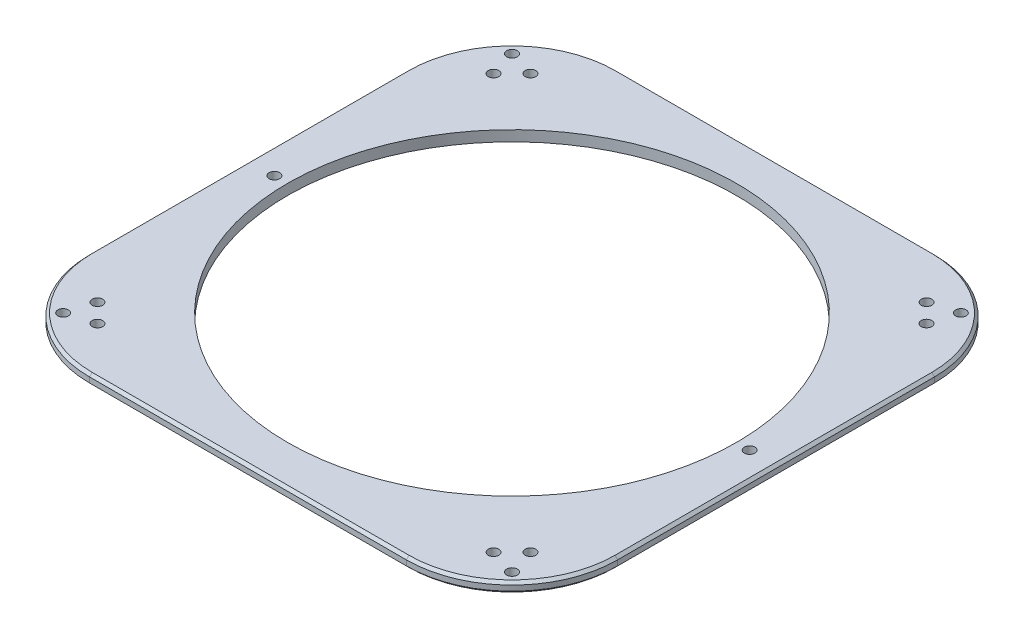
ISO-10303-21;
HEADER;
FILE_DESCRIPTION(('STEP AP214'),'2;1');
FILE_NAME('part.step','',(''),(''),'','','');
FILE_SCHEMA(('AUTOMOTIVE_DESIGN { 1 0 10303 214 1 1 1 1 }'));
ENDSEC;
DATA;
#1=APPLICATION_CONTEXT('core data for automotive mechanical design processes');
#2=APPLICATION_PROTOCOL_DEFINITION('international standard','automotive_design',2000,#1);
#3=PRODUCT_CONTEXT('',#1,'mechanical');
#4=PRODUCT('Part','Part','',(#3));
#5=PRODUCT_RELATED_PRODUCT_CATEGORY('part','',(#4));
#6=PRODUCT_DEFINITION_FORMATION('','',#4);
#7=PRODUCT_DEFINITION_CONTEXT('part definition',#1,'design');
#8=PRODUCT_DEFINITION('design','',#6,#7);
#9=PRODUCT_DEFINITION_SHAPE('','',#8);
#10=(LENGTH_UNIT() NAMED_UNIT(*) SI_UNIT(.MILLI.,.METRE.));
#11=(NAMED_UNIT(*) PLANE_ANGLE_UNIT() SI_UNIT($,.RADIAN.));
#12=(NAMED_UNIT(*) SI_UNIT($,.STERADIAN.) SOLID_ANGLE_UNIT());
#13=UNCERTAINTY_MEASURE_WITH_UNIT(LENGTH_MEASURE(1.E-05),#10,'distance_accuracy_value','');
#14=(GEOMETRIC_REPRESENTATION_CONTEXT(3) GLOBAL_UNCERTAINTY_ASSIGNED_CONTEXT((#13)) GLOBAL_UNIT_ASSIGNED_CONTEXT((#10,
#11,#12)) REPRESENTATION_CONTEXT('',''));
#15=CARTESIAN_POINT('',(0.,0.,0.));
#16=DIRECTION('',(0.,0.,1.));
#17=DIRECTION('',(1.,0.,0.));
#18=AXIS2_PLACEMENT_3D('',#15,#16,#17);
#19=CARTESIAN_POINT('',(0.,4.,0.));
#20=DIRECTION('',(0.,-1.,0.));
#21=DIRECTION('',(0.,0.,-1.));
#22=AXIS2_PLACEMENT_3D('',#19,#20,#21);
#23=PLANE('',#22);
#24=CARTESIAN_POINT('',(-60.,4.,-60.));
#25=DIRECTION('',(0.,-1.,0.));
#26=DIRECTION('',(0.,0.,-1.));
#27=AXIS2_PLACEMENT_3D('',#24,#25,#26);
#28=CIRCLE('',#27,39.);
#29=CARTESIAN_POINT('',(-60.,4.,-99.));
#30=VERTEX_POINT('',#29);
#31=CARTESIAN_POINT('',(-99.,4.,-60.));
#32=VERTEX_POINT('',#31);
#33=EDGE_CURVE('E65',#30,#32,#28,.F.);
#34=ORIENTED_EDGE('',*,*,#33,.T.);
#35=DIRECTION('',(0.,0.,1.));
#36=VECTOR('',#35,1.);
#37=CARTESIAN_POINT('',(-99.,4.,0.));
#38=LINE('',#37,#36);
#39=CARTESIAN_POINT('',(-98.9999999999999,4.,60.));
#40=VERTEX_POINT('',#39);
#41=EDGE_CURVE('E11',#32,#40,#38,.T.);
#42=ORIENTED_EDGE('',*,*,#41,.T.);
#43=CARTESIAN_POINT('',(-60.,4.,60.));
#44=DIRECTION('',(0.,-1.,0.));
#45=DIRECTION('',(0.,0.,-1.));
#46=AXIS2_PLACEMENT_3D('',#43,#44,#45);
#47=CIRCLE('',#46,39.);
#48=CARTESIAN_POINT('',(-60.,4.,99.));
#49=VERTEX_POINT('',#48);
#50=EDGE_CURVE('E50',#40,#49,#47,.F.);
#51=ORIENTED_EDGE('',*,*,#50,.T.);
#52=DIRECTION('',(1.,0.,0.));
#53=VECTOR('',#52,1.);
#54=CARTESIAN_POINT('',(0.,4.,99.));
#55=LINE('',#54,#53);
#56=CARTESIAN_POINT('',(60.,4.,99.));
#57=VERTEX_POINT('',#56);
#58=EDGE_CURVE('E260',#49,#57,#55,.T.);
#59=ORIENTED_EDGE('',*,*,#58,.T.);
#60=CARTESIAN_POINT('',(60.,4.,60.));
#61=DIRECTION('',(0.,-1.,0.));
#62=DIRECTION('',(0.,0.,-1.));
#63=AXIS2_PLACEMENT_3D('',#60,#61,#62);
#64=CIRCLE('',#63,39.);
#65=CARTESIAN_POINT('',(99.,4.,60.));
#66=VERTEX_POINT('',#65);
#67=EDGE_CURVE('E256',#57,#66,#64,.F.);
#68=ORIENTED_EDGE('',*,*,#67,.T.);
#69=DIRECTION('',(0.,0.,-1.));
#70=VECTOR('',#69,1.);
#71=CARTESIAN_POINT('',(99.,4.,0.));
#72=LINE('',#71,#70);
#73=CARTESIAN_POINT('',(99.,4.,-60.));
#74=VERTEX_POINT('',#73);
#75=EDGE_CURVE('E252',#66,#74,#72,.T.);
#76=ORIENTED_EDGE('',*,*,#75,.T.);
#77=CARTESIAN_POINT('',(60.,4.,-60.));
#78=DIRECTION('',(0.,-1.,0.));
#79=DIRECTION('',(0.,0.,-1.));
#80=AXIS2_PLACEMENT_3D('',#77,#78,#79);
#81=CIRCLE('',#80,39.);
#82=CARTESIAN_POINT('',(60.,4.,-99.));
#83=VERTEX_POINT('',#82);
#84=EDGE_CURVE('E254',#74,#83,#81,.F.);
#85=ORIENTED_EDGE('',*,*,#84,.T.);
#86=DIRECTION('',(-1.,0.,0.));
#87=VECTOR('',#86,1.);
#88=CARTESIAN_POINT('',(0.,4.,-99.));
#89=LINE('',#88,#87);
#90=EDGE_CURVE('E258',#83,#30,#89,.T.);
#91=ORIENTED_EDGE('',*,*,#90,.T.);
#92=EDGE_LOOP('',(#34,#42,#51,#59,#68,#76,#85,#91));
#93=FACE_BOUND('',#92,.T.);
#94=CARTESIAN_POINT('',(-85.,4.,-85.));
#95=DIRECTION('',(0.,1.,0.));
#96=DIRECTION('',(0.,0.,1.));
#97=AXIS2_PLACEMENT_3D('',#94,#95,#96);
#98=CIRCLE('',#97,2.);
#99=CARTESIAN_POINT('',(-85.,4.,-83.));
#100=VERTEX_POINT('',#99);
#101=EDGE_CURVE('E194',#100,#100,#98,.T.);
#102=ORIENTED_EDGE('',*,*,#101,.F.);
#103=EDGE_LOOP('',(#102));
#104=FACE_BOUND('',#103,.T.);
#105=CARTESIAN_POINT('',(85.,4.,-85.));
#106=DIRECTION('',(0.,1.,0.));
#107=DIRECTION('',(0.,0.,1.));
#108=AXIS2_PLACEMENT_3D('',#105,#106,#107);
#109=CIRCLE('',#108,2.00000000000001);
#110=CARTESIAN_POINT('',(85.,4.,-83.));
#111=VERTEX_POINT('',#110);
#112=EDGE_CURVE('E381',#111,#111,#109,.T.);
#113=ORIENTED_EDGE('',*,*,#112,.F.);
#114=EDGE_LOOP('',(#113));
#115=FACE_BOUND('',#114,.T.);
#116=CARTESIAN_POINT('',(85.,4.,85.));
#117=DIRECTION('',(0.,1.,0.));
#118=DIRECTION('',(0.,0.,1.));
#119=AXIS2_PLACEMENT_3D('',#116,#117,#118);
#120=CIRCLE('',#119,2.);
#121=CARTESIAN_POINT('',(85.,4.,87.));
#122=VERTEX_POINT('',#121);
#123=EDGE_CURVE('E385',#122,#122,#120,.T.);
#124=ORIENTED_EDGE('',*,*,#123,.F.);
#125=EDGE_LOOP('',(#124));
#126=FACE_BOUND('',#125,.T.);
#127=CARTESIAN_POINT('',(75.,4.,-82.));
#128=DIRECTION('',(0.,1.,0.));
#129=DIRECTION('',(0.,0.,1.));
#130=AXIS2_PLACEMENT_3D('',#127,#128,#129);
#131=CIRCLE('',#130,2.00000000000001);
#132=CARTESIAN_POINT('',(75.,4.,-80.));
#133=VERTEX_POINT('',#132);
#134=EDGE_CURVE('E389',#133,#133,#131,.T.);
#135=ORIENTED_EDGE('',*,*,#134,.F.);
#136=EDGE_LOOP('',(#135));
#137=FACE_BOUND('',#136,.T.);
#138=CARTESIAN_POINT('',(-85.,4.,85.));
#139=DIRECTION('',(0.,1.,0.));
#140=DIRECTION('',(0.,0.,1.));
#141=AXIS2_PLACEMENT_3D('',#138,#139,#140);
#142=CIRCLE('',#141,2.);
#143=CARTESIAN_POINT('',(-85.,4.,87.));
#144=VERTEX_POINT('',#143);
#145=EDGE_CURVE('E393',#144,#144,#142,.T.);
#146=ORIENTED_EDGE('',*,*,#145,.F.);
#147=EDGE_LOOP('',(#146));
#148=FACE_BOUND('',#147,.T.);
#149=CARTESIAN_POINT('',(82.,4.,75.));
#150=DIRECTION('',(0.,1.,0.));
#151=DIRECTION('',(0.,0.,1.));
#152=AXIS2_PLACEMENT_3D('',#149,#150,#151);
#153=CIRCLE('',#152,2.00000000000001);
#154=CARTESIAN_POINT('',(82.,4.,77.));
#155=VERTEX_POINT('',#154);
#156=EDGE_CURVE('E397',#155,#155,#153,.T.);
#157=ORIENTED_EDGE('',*,*,#156,.F.);
#158=EDGE_LOOP('',(#157));
#159=FACE_BOUND('',#158,.T.);
#160=CARTESIAN_POINT('',(-90.,4.,0.));
#161=DIRECTION('',(0.,1.,0.));
#162=DIRECTION('',(0.,0.,1.));
#163=AXIS2_PLACEMENT_3D('',#160,#161,#162);
#164=CIRCLE('',#163,2.);
#165=CARTESIAN_POINT('',(-90.,4.,2.));
#166=VERTEX_POINT('',#165);
#167=EDGE_CURVE('E401',#166,#166,#164,.T.);
#168=ORIENTED_EDGE('',*,*,#167,.F.);
#169=EDGE_LOOP('',(#168));
#170=FACE_BOUND('',#169,.T.);
#171=CARTESIAN_POINT('',(-75.,4.,-82.));
#172=DIRECTION('',(0.,1.,0.));
#173=DIRECTION('',(0.,0.,1.));
#174=AXIS2_PLACEMENT_3D('',#171,#172,#173);
#175=CIRCLE('',#174,2.00000000000001);
#176=CARTESIAN_POINT('',(-75.,4.,-80.));
#177=VERTEX_POINT('',#176);
#178=EDGE_CURVE('E405',#177,#177,#175,.T.);
#179=ORIENTED_EDGE('',*,*,#178,.F.);
#180=EDGE_LOOP('',(#179));
#181=FACE_BOUND('',#180,.T.);
#182=CARTESIAN_POINT('',(90.0000000000001,4.,0.));
#183=DIRECTION('',(0.,1.,0.));
#184=DIRECTION('',(0.,0.,-1.));
#185=AXIS2_PLACEMENT_3D('',#182,#183,#184);
#186=CIRCLE('',#185,2.);
#187=CARTESIAN_POINT('',(90.0000000000001,4.,-2.00000000000005));
#188=VERTEX_POINT('',#187);
#189=EDGE_CURVE('E409',#188,#188,#186,.T.);
#190=ORIENTED_EDGE('',*,*,#189,.F.);
#191=EDGE_LOOP('',(#190));
#192=FACE_BOUND('',#191,.T.);
#193=CARTESIAN_POINT('',(-82.,4.,75.));
#194=DIRECTION('',(0.,1.,0.));
#195=DIRECTION('',(0.,0.,1.));
#196=AXIS2_PLACEMENT_3D('',#193,#194,#195);
#197=CIRCLE('',#196,2.00000000000001);
#198=CARTESIAN_POINT('',(-82.,4.,77.));
#199=VERTEX_POINT('',#198);
#200=EDGE_CURVE('E413',#199,#199,#197,.T.);
#201=ORIENTED_EDGE('',*,*,#200,.F.);
#202=EDGE_LOOP('',(#201));
#203=FACE_BOUND('',#202,.T.);
#204=CARTESIAN_POINT('',(75.,4.,82.));
#205=DIRECTION('',(0.,1.,0.));
#206=DIRECTION('',(0.,0.,1.));
#207=AXIS2_PLACEMENT_3D('',#204,#205,#206);
#208=CIRCLE('',#207,2.00000000000001);
#209=CARTESIAN_POINT('',(75.,4.,84.));
#210=VERTEX_POINT('',#209);
#211=EDGE_CURVE('E417',#210,#210,#208,.T.);
#212=ORIENTED_EDGE('',*,*,#211,.F.);
#213=EDGE_LOOP('',(#212));
#214=FACE_BOUND('',#213,.T.);
#215=CARTESIAN_POINT('',(-75.,4.,82.));
#216=DIRECTION('',(0.,1.,0.));
#217=DIRECTION('',(0.,0.,1.));
#218=AXIS2_PLACEMENT_3D('',#215,#216,#217);
#219=CIRCLE('',#218,2.00000000000001);
#220=CARTESIAN_POINT('',(-75.,4.,84.));
#221=VERTEX_POINT('',#220);
#222=EDGE_CURVE('E421',#221,#221,#219,.T.);
#223=ORIENTED_EDGE('',*,*,#222,.F.);
#224=EDGE_LOOP('',(#223));
#225=FACE_BOUND('',#224,.T.);
#226=CARTESIAN_POINT('',(-82.,4.,-75.));
#227=DIRECTION('',(0.,1.,0.));
#228=DIRECTION('',(0.,0.,1.));
#229=AXIS2_PLACEMENT_3D('',#226,#227,#228);
#230=CIRCLE('',#229,2.00000000000001);
#231=CARTESIAN_POINT('',(-82.,4.,-73.));
#232=VERTEX_POINT('',#231);
#233=EDGE_CURVE('E425',#232,#232,#230,.T.);
#234=ORIENTED_EDGE('',*,*,#233,.F.);
#235=EDGE_LOOP('',(#234));
#236=FACE_BOUND('',#235,.T.);
#237=CARTESIAN_POINT('',(81.987312616707,4.,-75.0018830357969));
#238=DIRECTION('',(0.,1.,0.));
#239=DIRECTION('',(0.,0.,1.));
#240=AXIS2_PLACEMENT_3D('',#237,#238,#239);
#241=CIRCLE('',#240,2.00000000000001);
#242=CARTESIAN_POINT('',(81.987312616707,4.,-73.0018830357969));
#243=VERTEX_POINT('',#242);
#244=EDGE_CURVE('E429',#243,#243,#241,.T.);
#245=ORIENTED_EDGE('',*,*,#244,.F.);
#246=EDGE_LOOP('',(#245));
#247=FACE_BOUND('',#246,.T.);
#248=CARTESIAN_POINT('',(0.,4.,0.));
#249=DIRECTION('',(0.,1.,0.));
#250=DIRECTION('',(0.,0.,1.));
#251=AXIS2_PLACEMENT_3D('',#248,#249,#250);
#252=CIRCLE('',#251,85.);
#253=CARTESIAN_POINT('',(0.,4.,85.));
#254=VERTEX_POINT('',#253);
#255=EDGE_CURVE('E432',#254,#254,#252,.T.);
#256=ORIENTED_EDGE('',*,*,#255,.F.);
#257=EDGE_LOOP('',(#256));
#258=FACE_BOUND('',#257,.T.);
#259=ADVANCED_FACE('F40',(#93,#104,#115,#126,#137,#148,#159,#170,#181,#192,#203,#214,#225,#236,
#247,#258),#23,.F.);
#260=CARTESIAN_POINT('',(0.,0.,0.));
#261=DIRECTION('',(0.,-1.,0.));
#262=DIRECTION('',(0.,0.,-1.));
#263=AXIS2_PLACEMENT_3D('',#260,#261,#262);
#264=PLANE('',#263);
#265=CARTESIAN_POINT('',(-60.,0.,60.));
#266=DIRECTION('',(0.,-1.,0.));
#267=DIRECTION('',(0.,0.,-1.));
#268=AXIS2_PLACEMENT_3D('',#265,#266,#267);
#269=CIRCLE('',#268,39.);
#270=CARTESIAN_POINT('',(-60.,0.,99.));
#271=VERTEX_POINT('',#270);
#272=CARTESIAN_POINT('',(-98.9999999999999,0.,60.));
#273=VERTEX_POINT('',#272);
#274=EDGE_CURVE('E223',#271,#273,#269,.T.);
#275=ORIENTED_EDGE('',*,*,#274,.T.);
#276=DIRECTION('',(0.,0.,-1.));
#277=VECTOR('',#276,1.);
#278=CARTESIAN_POINT('',(-99.,0.,-60.));
#279=LINE('',#278,#277);
#280=CARTESIAN_POINT('',(-99.,0.,-60.));
#281=VERTEX_POINT('',#280);
#282=EDGE_CURVE('E225',#273,#281,#279,.T.);
#283=ORIENTED_EDGE('',*,*,#282,.T.);
#284=CARTESIAN_POINT('',(-60.,0.,-60.));
#285=DIRECTION('',(0.,-1.,0.));
#286=DIRECTION('',(0.,0.,-1.));
#287=AXIS2_PLACEMENT_3D('',#284,#285,#286);
#288=CIRCLE('',#287,39.);
#289=CARTESIAN_POINT('',(-60.,0.,-99.));
#290=VERTEX_POINT('',#289);
#291=EDGE_CURVE('E221',#281,#290,#288,.T.);
#292=ORIENTED_EDGE('',*,*,#291,.T.);
#293=DIRECTION('',(1.,0.,0.));
#294=VECTOR('',#293,1.);
#295=CARTESIAN_POINT('',(60.,0.,-99.));
#296=LINE('',#295,#294);
#297=CARTESIAN_POINT('',(60.,0.,-99.));
#298=VERTEX_POINT('',#297);
#299=EDGE_CURVE('E217',#290,#298,#296,.T.);
#300=ORIENTED_EDGE('',*,*,#299,.T.);
#301=CARTESIAN_POINT('',(60.,0.,-60.));
#302=DIRECTION('',(0.,-1.,0.));
#303=DIRECTION('',(0.,0.,-1.));
#304=AXIS2_PLACEMENT_3D('',#301,#302,#303);
#305=CIRCLE('',#304,39.);
#306=CARTESIAN_POINT('',(99.,0.,-60.));
#307=VERTEX_POINT('',#306);
#308=EDGE_CURVE('E213',#298,#307,#305,.T.);
#309=ORIENTED_EDGE('',*,*,#308,.T.);
#310=DIRECTION('',(0.,0.,1.));
#311=VECTOR('',#310,1.);
#312=CARTESIAN_POINT('',(99.,0.,60.));
#313=LINE('',#312,#311);
#314=CARTESIAN_POINT('',(99.,0.,60.));
#315=VERTEX_POINT('',#314);
#316=EDGE_CURVE('E211',#307,#315,#313,.T.);
#317=ORIENTED_EDGE('',*,*,#316,.T.);
#318=CARTESIAN_POINT('',(60.,0.,60.));
#319=DIRECTION('',(0.,-1.,0.));
#320=DIRECTION('',(0.,0.,-1.));
#321=AXIS2_PLACEMENT_3D('',#318,#319,#320);
#322=CIRCLE('',#321,39.);
#323=CARTESIAN_POINT('',(60.,0.,99.));
#324=VERTEX_POINT('',#323);
#325=EDGE_CURVE('E215',#315,#324,#322,.T.);
#326=ORIENTED_EDGE('',*,*,#325,.T.);
#327=DIRECTION('',(-1.,0.,0.));
#328=VECTOR('',#327,1.);
#329=CARTESIAN_POINT('',(-60.,0.,99.));
#330=LINE('',#329,#328);
#331=EDGE_CURVE('E219',#324,#271,#330,.T.);
#332=ORIENTED_EDGE('',*,*,#331,.T.);
#333=EDGE_LOOP('',(#275,#283,#292,#300,#309,#317,#326,#332));
#334=FACE_BOUND('',#333,.T.);
#335=CARTESIAN_POINT('',(81.987312616707,0.,-75.0018830357969));
#336=DIRECTION('',(0.,1.,0.));
#337=DIRECTION('',(0.,0.,1.));
#338=AXIS2_PLACEMENT_3D('',#335,#336,#337);
#339=CIRCLE('',#338,2.00000000000001);
#340=CARTESIAN_POINT('',(81.987312616707,0.,-73.0018830357969));
#341=VERTEX_POINT('',#340);
#342=EDGE_CURVE('E434',#341,#341,#339,.T.);
#343=ORIENTED_EDGE('',*,*,#342,.T.);
#344=EDGE_LOOP('',(#343));
#345=FACE_BOUND('',#344,.T.);
#346=CARTESIAN_POINT('',(-75.,0.,82.));
#347=DIRECTION('',(0.,1.,0.));
#348=DIRECTION('',(0.,0.,1.));
#349=AXIS2_PLACEMENT_3D('',#346,#347,#348);
#350=CIRCLE('',#349,2.00000000000001);
#351=CARTESIAN_POINT('',(-75.,0.,84.));
#352=VERTEX_POINT('',#351);
#353=EDGE_CURVE('E444',#352,#352,#350,.T.);
#354=ORIENTED_EDGE('',*,*,#353,.T.);
#355=EDGE_LOOP('',(#354));
#356=FACE_BOUND('',#355,.T.);
#357=CARTESIAN_POINT('',(-82.,0.,75.));
#358=DIRECTION('',(0.,1.,0.));
#359=DIRECTION('',(0.,0.,1.));
#360=AXIS2_PLACEMENT_3D('',#357,#358,#359);
#361=CIRCLE('',#360,2.00000000000001);
#362=CARTESIAN_POINT('',(-82.,0.,77.));
#363=VERTEX_POINT('',#362);
#364=EDGE_CURVE('E452',#363,#363,#361,.T.);
#365=ORIENTED_EDGE('',*,*,#364,.T.);
#366=EDGE_LOOP('',(#365));
#367=FACE_BOUND('',#366,.T.);
#368=CARTESIAN_POINT('',(-75.,0.,-82.));
#369=DIRECTION('',(0.,1.,0.));
#370=DIRECTION('',(0.,0.,1.));
#371=AXIS2_PLACEMENT_3D('',#368,#369,#370);
#372=CIRCLE('',#371,2.00000000000001);
#373=CARTESIAN_POINT('',(-75.,0.,-80.));
#374=VERTEX_POINT('',#373);
#375=EDGE_CURVE('E460',#374,#374,#372,.T.);
#376=ORIENTED_EDGE('',*,*,#375,.T.);
#377=EDGE_LOOP('',(#376));
#378=FACE_BOUND('',#377,.T.);
#379=CARTESIAN_POINT('',(82.,0.,75.));
#380=DIRECTION('',(0.,1.,0.));
#381=DIRECTION('',(0.,0.,1.));
#382=AXIS2_PLACEMENT_3D('',#379,#380,#381);
#383=CIRCLE('',#382,2.00000000000001);
#384=CARTESIAN_POINT('',(82.,0.,77.));
#385=VERTEX_POINT('',#384);
#386=EDGE_CURVE('E468',#385,#385,#383,.T.);
#387=ORIENTED_EDGE('',*,*,#386,.T.);
#388=EDGE_LOOP('',(#387));
#389=FACE_BOUND('',#388,.T.);
#390=CARTESIAN_POINT('',(75.,0.,-82.));
#391=DIRECTION('',(0.,1.,0.));
#392=DIRECTION('',(0.,0.,1.));
#393=AXIS2_PLACEMENT_3D('',#390,#391,#392);
#394=CIRCLE('',#393,2.00000000000001);
#395=CARTESIAN_POINT('',(75.,0.,-80.));
#396=VERTEX_POINT('',#395);
#397=EDGE_CURVE('E476',#396,#396,#394,.T.);
#398=ORIENTED_EDGE('',*,*,#397,.T.);
#399=EDGE_LOOP('',(#398));
#400=FACE_BOUND('',#399,.T.);
#401=CARTESIAN_POINT('',(85.,0.,-85.));
#402=DIRECTION('',(0.,1.,0.));
#403=DIRECTION('',(0.,0.,1.));
#404=AXIS2_PLACEMENT_3D('',#401,#402,#403);
#405=CIRCLE('',#404,2.00000000000001);
#406=CARTESIAN_POINT('',(85.,0.,-83.));
#407=VERTEX_POINT('',#406);
#408=EDGE_CURVE('E484',#407,#407,#405,.T.);
#409=ORIENTED_EDGE('',*,*,#408,.T.);
#410=EDGE_LOOP('',(#409));
#411=FACE_BOUND('',#410,.T.);
#412=CARTESIAN_POINT('',(-85.,0.,-85.));
#413=DIRECTION('',(0.,1.,0.));
#414=DIRECTION('',(0.,0.,1.));
#415=AXIS2_PLACEMENT_3D('',#412,#413,#414);
#416=CIRCLE('',#415,2.);
#417=CARTESIAN_POINT('',(-85.,0.,-83.));
#418=VERTEX_POINT('',#417);
#419=EDGE_CURVE('E488',#418,#418,#416,.T.);
#420=ORIENTED_EDGE('',*,*,#419,.T.);
#421=EDGE_LOOP('',(#420));
#422=FACE_BOUND('',#421,.T.);
#423=CARTESIAN_POINT('',(85.,0.,85.));
#424=DIRECTION('',(0.,1.,0.));
#425=DIRECTION('',(0.,0.,1.));
#426=AXIS2_PLACEMENT_3D('',#423,#424,#425);
#427=CIRCLE('',#426,2.);
#428=CARTESIAN_POINT('',(85.,0.,87.));
#429=VERTEX_POINT('',#428);
#430=EDGE_CURVE('E480',#429,#429,#427,.T.);
#431=ORIENTED_EDGE('',*,*,#430,.T.);
#432=EDGE_LOOP('',(#431));
#433=FACE_BOUND('',#432,.T.);
#434=CARTESIAN_POINT('',(-85.,0.,85.));
#435=DIRECTION('',(0.,1.,0.));
#436=DIRECTION('',(0.,0.,1.));
#437=AXIS2_PLACEMENT_3D('',#434,#435,#436);
#438=CIRCLE('',#437,2.);
#439=CARTESIAN_POINT('',(-85.,0.,87.));
#440=VERTEX_POINT('',#439);
#441=EDGE_CURVE('E472',#440,#440,#438,.T.);
#442=ORIENTED_EDGE('',*,*,#441,.T.);
#443=EDGE_LOOP('',(#442));
#444=FACE_BOUND('',#443,.T.);
#445=CARTESIAN_POINT('',(-90.,0.,0.));
#446=DIRECTION('',(0.,1.,0.));
#447=DIRECTION('',(0.,0.,1.));
#448=AXIS2_PLACEMENT_3D('',#445,#446,#447);
#449=CIRCLE('',#448,2.);
#450=CARTESIAN_POINT('',(-90.,0.,2.));
#451=VERTEX_POINT('',#450);
#452=EDGE_CURVE('E464',#451,#451,#449,.T.);
#453=ORIENTED_EDGE('',*,*,#452,.T.);
#454=EDGE_LOOP('',(#453));
#455=FACE_BOUND('',#454,.T.);
#456=CARTESIAN_POINT('',(90.0000000000001,0.,0.));
#457=DIRECTION('',(0.,1.,0.));
#458=DIRECTION('',(0.,0.,-1.));
#459=AXIS2_PLACEMENT_3D('',#456,#457,#458);
#460=CIRCLE('',#459,2.);
#461=CARTESIAN_POINT('',(90.0000000000001,0.,-2.00000000000005));
#462=VERTEX_POINT('',#461);
#463=EDGE_CURVE('E456',#462,#462,#460,.T.);
#464=ORIENTED_EDGE('',*,*,#463,.T.);
#465=EDGE_LOOP('',(#464));
#466=FACE_BOUND('',#465,.T.);
#467=CARTESIAN_POINT('',(75.,0.,82.));
#468=DIRECTION('',(0.,1.,0.));
#469=DIRECTION('',(0.,0.,1.));
#470=AXIS2_PLACEMENT_3D('',#467,#468,#469);
#471=CIRCLE('',#470,2.00000000000001);
#472=CARTESIAN_POINT('',(75.,0.,84.));
#473=VERTEX_POINT('',#472);
#474=EDGE_CURVE('E448',#473,#473,#471,.T.);
#475=ORIENTED_EDGE('',*,*,#474,.T.);
#476=EDGE_LOOP('',(#475));
#477=FACE_BOUND('',#476,.T.);
#478=CARTESIAN_POINT('',(-82.,0.,-75.));
#479=DIRECTION('',(0.,1.,0.));
#480=DIRECTION('',(0.,0.,1.));
#481=AXIS2_PLACEMENT_3D('',#478,#479,#480);
#482=CIRCLE('',#481,2.00000000000001);
#483=CARTESIAN_POINT('',(-82.,0.,-73.));
#484=VERTEX_POINT('',#483);
#485=EDGE_CURVE('E441',#484,#484,#482,.T.);
#486=ORIENTED_EDGE('',*,*,#485,.T.);
#487=EDGE_LOOP('',(#486));
#488=FACE_BOUND('',#487,.T.);
#489=CARTESIAN_POINT('',(0.,0.,0.));
#490=DIRECTION('',(0.,1.,0.));
#491=DIRECTION('',(0.,0.,1.));
#492=AXIS2_PLACEMENT_3D('',#489,#490,#491);
#493=CIRCLE('',#492,85.);
#494=CARTESIAN_POINT('',(0.,0.,85.));
#495=VERTEX_POINT('',#494);
#496=EDGE_CURVE('E286',#495,#495,#493,.T.);
#497=ORIENTED_EDGE('',*,*,#496,.T.);
#498=EDGE_LOOP('',(#497));
#499=FACE_BOUND('',#498,.T.);
#500=ADVANCED_FACE('F333',(#334,#345,#356,#367,#378,#389,#400,#411,#422,#433,#444,#455,#466,
#477,#488,#499),#264,.T.);
#501=CARTESIAN_POINT('',(100.,4.,100.));
#502=DIRECTION('',(-1.,0.,0.));
#503=DIRECTION('',(0.,0.,1.));
#504=AXIS2_PLACEMENT_3D('',#501,#502,#503);
#505=PLANE('',#504);
#506=DIRECTION('',(0.,-1.,0.));
#507=VECTOR('',#506,1.);
#508=CARTESIAN_POINT('',(100.,4.,60.));
#509=LINE('',#508,#507);
#510=CARTESIAN_POINT('',(100.,2.99999999999997,60.));
#511=VERTEX_POINT('',#510);
#512=CARTESIAN_POINT('',(100.,1.00000000000003,60.));
#513=VERTEX_POINT('',#512);
#514=EDGE_CURVE('E205',#511,#513,#509,.T.);
#515=ORIENTED_EDGE('',*,*,#514,.T.);
#516=DIRECTION('',(0.,0.,-1.));
#517=VECTOR('',#516,1.);
#518=CARTESIAN_POINT('',(100.,1.00000000000003,-60.));
#519=LINE('',#518,#517);
#520=CARTESIAN_POINT('',(100.,1.00000000000003,-60.));
#521=VERTEX_POINT('',#520);
#522=EDGE_CURVE('E250',#513,#521,#519,.T.);
#523=ORIENTED_EDGE('',*,*,#522,.T.);
#524=DIRECTION('',(0.,-1.,0.));
#525=VECTOR('',#524,1.);
#526=CARTESIAN_POINT('',(100.,4.,-60.));
#527=LINE('',#526,#525);
#528=CARTESIAN_POINT('',(100.,2.99999999999997,-60.));
#529=VERTEX_POINT('',#528);
#530=EDGE_CURVE('E185',#521,#529,#527,.F.);
#531=ORIENTED_EDGE('',*,*,#530,.T.);
#532=DIRECTION('',(0.,0.,1.));
#533=VECTOR('',#532,1.);
#534=CARTESIAN_POINT('',(100.,2.99999999999997,100.));
#535=LINE('',#534,#533);
#536=EDGE_CURVE('E248',#529,#511,#535,.T.);
#537=ORIENTED_EDGE('',*,*,#536,.T.);
#538=EDGE_LOOP('',(#515,#523,#531,#537));
#539=FACE_BOUND('',#538,.T.);
#540=ADVANCED_FACE('F314',(#539),#505,.F.);
#541=CARTESIAN_POINT('',(-100.,4.,-100.));
#542=DIRECTION('',(0.,0.,1.));
#543=DIRECTION('',(1.,0.,0.));
#544=AXIS2_PLACEMENT_3D('',#541,#542,#543);
#545=PLANE('',#544);
#546=DIRECTION('',(0.,-1.,0.));
#547=VECTOR('',#546,1.);
#548=CARTESIAN_POINT('',(60.,4.,-100.));
#549=LINE('',#548,#547);
#550=CARTESIAN_POINT('',(60.,2.99999999999997,-100.));
#551=VERTEX_POINT('',#550);
#552=CARTESIAN_POINT('',(60.,1.00000000000003,-100.));
#553=VERTEX_POINT('',#552);
#554=EDGE_CURVE('E189',#551,#553,#549,.T.);
#555=ORIENTED_EDGE('',*,*,#554,.T.);
#556=DIRECTION('',(-1.,0.,0.));
#557=VECTOR('',#556,1.);
#558=CARTESIAN_POINT('',(-60.,1.00000000000003,-100.));
#559=LINE('',#558,#557);
#560=CARTESIAN_POINT('',(-60.,1.00000000000003,-100.));
#561=VERTEX_POINT('',#560);
#562=EDGE_CURVE('E238',#553,#561,#559,.T.);
#563=ORIENTED_EDGE('',*,*,#562,.T.);
#564=DIRECTION('',(0.,-1.,0.));
#565=VECTOR('',#564,1.);
#566=CARTESIAN_POINT('',(-60.,4.,-100.));
#567=LINE('',#566,#565);
#568=CARTESIAN_POINT('',(-60.,2.99999999999997,-100.));
#569=VERTEX_POINT('',#568);
#570=EDGE_CURVE('E192',#561,#569,#567,.F.);
#571=ORIENTED_EDGE('',*,*,#570,.T.);
#572=DIRECTION('',(1.,0.,0.));
#573=VECTOR('',#572,1.);
#574=CARTESIAN_POINT('',(-100.,2.99999999999997,-100.));
#575=LINE('',#574,#573);
#576=EDGE_CURVE('E236',#569,#551,#575,.T.);
#577=ORIENTED_EDGE('',*,*,#576,.T.);
#578=EDGE_LOOP('',(#555,#563,#571,#577));
#579=FACE_BOUND('',#578,.T.);
#580=ADVANCED_FACE('F347',(#579),#545,.F.);
#581=CARTESIAN_POINT('',(-100.,4.,100.));
#582=DIRECTION('',(1.,0.,0.));
#583=DIRECTION('',(0.,0.,-1.));
#584=AXIS2_PLACEMENT_3D('',#581,#582,#583);
#585=PLANE('',#584);
#586=DIRECTION('',(0.,-1.,0.));
#587=VECTOR('',#586,1.);
#588=CARTESIAN_POINT('',(-100.,4.,-60.));
#589=LINE('',#588,#587);
#590=CARTESIAN_POINT('',(-100.,2.99999999999997,-60.));
#591=VERTEX_POINT('',#590);
#592=CARTESIAN_POINT('',(-100.,1.00000000000003,-60.));
#593=VERTEX_POINT('',#592);
#594=EDGE_CURVE('E180',#591,#593,#589,.T.);
#595=ORIENTED_EDGE('',*,*,#594,.T.);
#596=DIRECTION('',(0.,0.,1.));
#597=VECTOR('',#596,1.);
#598=CARTESIAN_POINT('',(-100.,1.00000000000003,60.));
#599=LINE('',#598,#597);
#600=CARTESIAN_POINT('',(-100.,1.00000000000003,60.));
#601=VERTEX_POINT('',#600);
#602=EDGE_CURVE('E184',#593,#601,#599,.T.);
#603=ORIENTED_EDGE('',*,*,#602,.T.);
#604=DIRECTION('',(0.,-1.,0.));
#605=VECTOR('',#604,1.);
#606=CARTESIAN_POINT('',(-100.,4.,60.));
#607=LINE('',#606,#605);
#608=CARTESIAN_POINT('',(-100.,2.99999999999997,60.));
#609=VERTEX_POINT('',#608);
#610=EDGE_CURVE('E183',#601,#609,#607,.F.);
#611=ORIENTED_EDGE('',*,*,#610,.T.);
#612=DIRECTION('',(0.,0.,-1.));
#613=VECTOR('',#612,1.);
#614=CARTESIAN_POINT('',(-100.,2.99999999999997,100.));
#615=LINE('',#614,#613);
#616=EDGE_CURVE('E159',#609,#591,#615,.T.);
#617=ORIENTED_EDGE('',*,*,#616,.T.);
#618=EDGE_LOOP('',(#595,#603,#611,#617));
#619=FACE_BOUND('',#618,.T.);
#620=ADVANCED_FACE('F178',(#619),#585,.F.);
#621=CARTESIAN_POINT('',(-100.,4.,100.));
#622=DIRECTION('',(0.,0.,-1.));
#623=DIRECTION('',(-1.,0.,0.));
#624=AXIS2_PLACEMENT_3D('',#621,#622,#623);
#625=PLANE('',#624);
#626=DIRECTION('',(0.,-1.,0.));
#627=VECTOR('',#626,1.);
#628=CARTESIAN_POINT('',(-60.,4.,100.));
#629=LINE('',#628,#627);
#630=CARTESIAN_POINT('',(-60.,2.99999999999997,100.));
#631=VERTEX_POINT('',#630);
#632=CARTESIAN_POINT('',(-60.,1.00000000000003,100.));
#633=VERTEX_POINT('',#632);
#634=EDGE_CURVE('E202',#631,#633,#629,.T.);
#635=ORIENTED_EDGE('',*,*,#634,.T.);
#636=DIRECTION('',(1.,0.,0.));
#637=VECTOR('',#636,1.);
#638=CARTESIAN_POINT('',(60.,1.00000000000003,100.));
#639=LINE('',#638,#637);
#640=CARTESIAN_POINT('',(60.,1.00000000000003,100.));
#641=VERTEX_POINT('',#640);
#642=EDGE_CURVE('E234',#633,#641,#639,.T.);
#643=ORIENTED_EDGE('',*,*,#642,.T.);
#644=DIRECTION('',(0.,-1.,0.));
#645=VECTOR('',#644,1.);
#646=CARTESIAN_POINT('',(60.,4.,100.));
#647=LINE('',#646,#645);
#648=CARTESIAN_POINT('',(60.,2.99999999999997,100.));
#649=VERTEX_POINT('',#648);
#650=EDGE_CURVE('E199',#641,#649,#647,.F.);
#651=ORIENTED_EDGE('',*,*,#650,.T.);
#652=DIRECTION('',(-1.,0.,0.));
#653=VECTOR('',#652,1.);
#654=CARTESIAN_POINT('',(-100.,2.99999999999997,100.));
#655=LINE('',#654,#653);
#656=EDGE_CURVE('E232',#649,#631,#655,.T.);
#657=ORIENTED_EDGE('',*,*,#656,.T.);
#658=EDGE_LOOP('',(#635,#643,#651,#657));
#659=FACE_BOUND('',#658,.T.);
#660=ADVANCED_FACE('F499',(#659),#625,.F.);
#661=CARTESIAN_POINT('',(-85.,4.,-85.));
#662=DIRECTION('',(0.,-1.,0.));
#663=DIRECTION('',(0.,0.,-1.));
#664=AXIS2_PLACEMENT_3D('',#661,#662,#663);
#665=CYLINDRICAL_SURFACE('',#664,2.);
#666=ORIENTED_EDGE('',*,*,#101,.T.);
#667=EDGE_LOOP('',(#666));
#668=FACE_BOUND('',#667,.T.);
#669=ORIENTED_EDGE('',*,*,#419,.F.);
#670=EDGE_LOOP('',(#669));
#671=FACE_BOUND('',#670,.T.);
#672=ADVANCED_FACE('F496',(#668,#671),#665,.F.);
#673=CARTESIAN_POINT('',(85.,4.,-85.));
#674=DIRECTION('',(0.,-1.,0.));
#675=DIRECTION('',(0.,0.,-1.));
#676=AXIS2_PLACEMENT_3D('',#673,#674,#675);
#677=CYLINDRICAL_SURFACE('',#676,2.00000000000001);
#678=ORIENTED_EDGE('',*,*,#112,.T.);
#679=EDGE_LOOP('',(#678));
#680=FACE_BOUND('',#679,.T.);
#681=ORIENTED_EDGE('',*,*,#408,.F.);
#682=EDGE_LOOP('',(#681));
#683=FACE_BOUND('',#682,.T.);
#684=ADVANCED_FACE('F498',(#680,#683),#677,.F.);
#685=CARTESIAN_POINT('',(85.,4.,85.));
#686=DIRECTION('',(0.,-1.,0.));
#687=DIRECTION('',(0.,0.,-1.));
#688=AXIS2_PLACEMENT_3D('',#685,#686,#687);
#689=CYLINDRICAL_SURFACE('',#688,2.);
#690=ORIENTED_EDGE('',*,*,#123,.T.);
#691=EDGE_LOOP('',(#690));
#692=FACE_BOUND('',#691,.T.);
#693=ORIENTED_EDGE('',*,*,#430,.F.);
#694=EDGE_LOOP('',(#693));
#695=FACE_BOUND('',#694,.T.);
#696=ADVANCED_FACE('F506',(#692,#695),#689,.F.);
#697=CARTESIAN_POINT('',(75.,4.,-82.));
#698=DIRECTION('',(0.,-1.,0.));
#699=DIRECTION('',(0.,0.,-1.));
#700=AXIS2_PLACEMENT_3D('',#697,#698,#699);
#701=CYLINDRICAL_SURFACE('',#700,2.00000000000001);
#702=ORIENTED_EDGE('',*,*,#134,.T.);
#703=EDGE_LOOP('',(#702));
#704=FACE_BOUND('',#703,.T.);
#705=ORIENTED_EDGE('',*,*,#397,.F.);
#706=EDGE_LOOP('',(#705));
#707=FACE_BOUND('',#706,.T.);
#708=ADVANCED_FACE('F757',(#704,#707),#701,.F.);
#709=CARTESIAN_POINT('',(-85.,4.,85.));
#710=DIRECTION('',(0.,-1.,0.));
#711=DIRECTION('',(0.,0.,-1.));
#712=AXIS2_PLACEMENT_3D('',#709,#710,#711);
#713=CYLINDRICAL_SURFACE('',#712,2.);
#714=ORIENTED_EDGE('',*,*,#145,.T.);
#715=EDGE_LOOP('',(#714));
#716=FACE_BOUND('',#715,.T.);
#717=ORIENTED_EDGE('',*,*,#441,.F.);
#718=EDGE_LOOP('',(#717));
#719=FACE_BOUND('',#718,.T.);
#720=ADVANCED_FACE('F749',(#716,#719),#713,.F.);
#721=CARTESIAN_POINT('',(82.,4.,75.));
#722=DIRECTION('',(0.,-1.,0.));
#723=DIRECTION('',(0.,0.,-1.));
#724=AXIS2_PLACEMENT_3D('',#721,#722,#723);
#725=CYLINDRICAL_SURFACE('',#724,2.00000000000001);
#726=ORIENTED_EDGE('',*,*,#156,.T.);
#727=EDGE_LOOP('',(#726));
#728=FACE_BOUND('',#727,.T.);
#729=ORIENTED_EDGE('',*,*,#386,.F.);
#730=EDGE_LOOP('',(#729));
#731=FACE_BOUND('',#730,.T.);
#732=ADVANCED_FACE('F741',(#728,#731),#725,.F.);
#733=CARTESIAN_POINT('',(-90.,4.,0.));
#734=DIRECTION('',(0.,-1.,0.));
#735=DIRECTION('',(0.,0.,-1.));
#736=AXIS2_PLACEMENT_3D('',#733,#734,#735);
#737=CYLINDRICAL_SURFACE('',#736,2.);
#738=ORIENTED_EDGE('',*,*,#167,.T.);
#739=EDGE_LOOP('',(#738));
#740=FACE_BOUND('',#739,.T.);
#741=ORIENTED_EDGE('',*,*,#452,.F.);
#742=EDGE_LOOP('',(#741));
#743=FACE_BOUND('',#742,.T.);
#744=ADVANCED_FACE('F733',(#740,#743),#737,.F.);
#745=CARTESIAN_POINT('',(-75.,4.,-82.));
#746=DIRECTION('',(0.,-1.,0.));
#747=DIRECTION('',(0.,0.,-1.));
#748=AXIS2_PLACEMENT_3D('',#745,#746,#747);
#749=CYLINDRICAL_SURFACE('',#748,2.00000000000001);
#750=ORIENTED_EDGE('',*,*,#178,.T.);
#751=EDGE_LOOP('',(#750));
#752=FACE_BOUND('',#751,.T.);
#753=ORIENTED_EDGE('',*,*,#375,.F.);
#754=EDGE_LOOP('',(#753));
#755=FACE_BOUND('',#754,.T.);
#756=ADVANCED_FACE('F725',(#752,#755),#749,.F.);
#757=CARTESIAN_POINT('',(90.0000000000001,4.,0.));
#758=DIRECTION('',(0.,-1.,0.));
#759=DIRECTION('',(0.,0.,-1.));
#760=AXIS2_PLACEMENT_3D('',#757,#758,#759);
#761=CYLINDRICAL_SURFACE('',#760,2.);
#762=ORIENTED_EDGE('',*,*,#189,.T.);
#763=EDGE_LOOP('',(#762));
#764=FACE_BOUND('',#763,.T.);
#765=ORIENTED_EDGE('',*,*,#463,.F.);
#766=EDGE_LOOP('',(#765));
#767=FACE_BOUND('',#766,.T.);
#768=ADVANCED_FACE('F717',(#764,#767),#761,.F.);
#769=CARTESIAN_POINT('',(-82.,4.,75.));
#770=DIRECTION('',(0.,-1.,0.));
#771=DIRECTION('',(0.,0.,-1.));
#772=AXIS2_PLACEMENT_3D('',#769,#770,#771);
#773=CYLINDRICAL_SURFACE('',#772,2.00000000000001);
#774=ORIENTED_EDGE('',*,*,#200,.T.);
#775=EDGE_LOOP('',(#774));
#776=FACE_BOUND('',#775,.T.);
#777=ORIENTED_EDGE('',*,*,#364,.F.);
#778=EDGE_LOOP('',(#777));
#779=FACE_BOUND('',#778,.T.);
#780=ADVANCED_FACE('F709',(#776,#779),#773,.F.);
#781=CARTESIAN_POINT('',(75.,4.,82.));
#782=DIRECTION('',(0.,-1.,0.));
#783=DIRECTION('',(0.,0.,-1.));
#784=AXIS2_PLACEMENT_3D('',#781,#782,#783);
#785=CYLINDRICAL_SURFACE('',#784,2.00000000000001);
#786=ORIENTED_EDGE('',*,*,#211,.T.);
#787=EDGE_LOOP('',(#786));
#788=FACE_BOUND('',#787,.T.);
#789=ORIENTED_EDGE('',*,*,#474,.F.);
#790=EDGE_LOOP('',(#789));
#791=FACE_BOUND('',#790,.T.);
#792=ADVANCED_FACE('F701',(#788,#791),#785,.F.);
#793=CARTESIAN_POINT('',(-75.,4.,82.));
#794=DIRECTION('',(0.,-1.,0.));
#795=DIRECTION('',(0.,0.,-1.));
#796=AXIS2_PLACEMENT_3D('',#793,#794,#795);
#797=CYLINDRICAL_SURFACE('',#796,2.00000000000001);
#798=ORIENTED_EDGE('',*,*,#222,.T.);
#799=EDGE_LOOP('',(#798));
#800=FACE_BOUND('',#799,.T.);
#801=ORIENTED_EDGE('',*,*,#353,.F.);
#802=EDGE_LOOP('',(#801));
#803=FACE_BOUND('',#802,.T.);
#804=ADVANCED_FACE('F693',(#800,#803),#797,.F.);
#805=CARTESIAN_POINT('',(-82.,4.,-75.));
#806=DIRECTION('',(0.,-1.,0.));
#807=DIRECTION('',(0.,0.,-1.));
#808=AXIS2_PLACEMENT_3D('',#805,#806,#807);
#809=CYLINDRICAL_SURFACE('',#808,2.00000000000001);
#810=ORIENTED_EDGE('',*,*,#233,.T.);
#811=EDGE_LOOP('',(#810));
#812=FACE_BOUND('',#811,.T.);
#813=ORIENTED_EDGE('',*,*,#485,.F.);
#814=EDGE_LOOP('',(#813));
#815=FACE_BOUND('',#814,.T.);
#816=ADVANCED_FACE('F685',(#812,#815),#809,.F.);
#817=CARTESIAN_POINT('',(81.987312616707,4.,-75.0018830357969));
#818=DIRECTION('',(0.,-1.,0.));
#819=DIRECTION('',(0.,0.,-1.));
#820=AXIS2_PLACEMENT_3D('',#817,#818,#819);
#821=CYLINDRICAL_SURFACE('',#820,2.00000000000001);
#822=ORIENTED_EDGE('',*,*,#244,.T.);
#823=EDGE_LOOP('',(#822));
#824=FACE_BOUND('',#823,.T.);
#825=ORIENTED_EDGE('',*,*,#342,.F.);
#826=EDGE_LOOP('',(#825));
#827=FACE_BOUND('',#826,.T.);
#828=ADVANCED_FACE('F679',(#824,#827),#821,.F.);
#829=CARTESIAN_POINT('',(0.,4.,0.));
#830=DIRECTION('',(0.,-1.,0.));
#831=DIRECTION('',(0.,0.,-1.));
#832=AXIS2_PLACEMENT_3D('',#829,#830,#831);
#833=CYLINDRICAL_SURFACE('',#832,85.);
#834=ORIENTED_EDGE('',*,*,#255,.T.);
#835=EDGE_LOOP('',(#834));
#836=FACE_BOUND('',#835,.T.);
#837=ORIENTED_EDGE('',*,*,#496,.F.);
#838=EDGE_LOOP('',(#837));
#839=FACE_BOUND('',#838,.T.);
#840=ADVANCED_FACE('F524',(#836,#839),#833,.F.);
#841=CARTESIAN_POINT('',(-60.,4.,-60.));
#842=DIRECTION('',(0.,-1.,0.));
#843=DIRECTION('',(0.,0.,-1.));
#844=AXIS2_PLACEMENT_3D('',#841,#842,#843);
#845=CYLINDRICAL_SURFACE('',#844,40.);
#846=ORIENTED_EDGE('',*,*,#570,.F.);
#847=CARTESIAN_POINT('',(-60.,1.00000000000003,-60.));
#848=DIRECTION('',(0.,-1.,0.));
#849=DIRECTION('',(0.,0.,-1.));
#850=AXIS2_PLACEMENT_3D('',#847,#848,#849);
#851=CIRCLE('',#850,40.);
#852=EDGE_CURVE('E172',#561,#593,#851,.F.);
#853=ORIENTED_EDGE('',*,*,#852,.T.);
#854=ORIENTED_EDGE('',*,*,#594,.F.);
#855=CARTESIAN_POINT('',(-60.,2.99999999999997,-60.));
#856=DIRECTION('',(0.,-1.,0.));
#857=DIRECTION('',(0.,0.,-1.));
#858=AXIS2_PLACEMENT_3D('',#855,#856,#857);
#859=CIRCLE('',#858,40.);
#860=EDGE_CURVE('E164',#591,#569,#859,.T.);
#861=ORIENTED_EDGE('',*,*,#860,.T.);
#862=EDGE_LOOP('',(#846,#853,#854,#861));
#863=FACE_BOUND('',#862,.T.);
#864=ADVANCED_FACE('F187',(#863),#845,.T.);
#865=CARTESIAN_POINT('',(-60.,4.,60.));
#866=DIRECTION('',(0.,-1.,0.));
#867=DIRECTION('',(0.,0.,-1.));
#868=AXIS2_PLACEMENT_3D('',#865,#866,#867);
#869=CYLINDRICAL_SURFACE('',#868,40.);
#870=ORIENTED_EDGE('',*,*,#610,.F.);
#871=CARTESIAN_POINT('',(-60.,1.00000000000003,60.));
#872=DIRECTION('',(0.,-1.,0.));
#873=DIRECTION('',(0.,0.,-1.));
#874=AXIS2_PLACEMENT_3D('',#871,#872,#873);
#875=CIRCLE('',#874,40.);
#876=EDGE_CURVE('E173',#601,#633,#875,.F.);
#877=ORIENTED_EDGE('',*,*,#876,.T.);
#878=ORIENTED_EDGE('',*,*,#634,.F.);
#879=CARTESIAN_POINT('',(-60.,2.99999999999997,60.));
#880=DIRECTION('',(0.,-1.,0.));
#881=DIRECTION('',(0.,0.,-1.));
#882=AXIS2_PLACEMENT_3D('',#879,#880,#881);
#883=CIRCLE('',#882,40.);
#884=EDGE_CURVE('E228',#631,#609,#883,.T.);
#885=ORIENTED_EDGE('',*,*,#884,.T.);
#886=EDGE_LOOP('',(#870,#877,#878,#885));
#887=FACE_BOUND('',#886,.T.);
#888=ADVANCED_FACE('F365',(#887),#869,.T.);
#889=CARTESIAN_POINT('',(60.,4.,-60.));
#890=DIRECTION('',(0.,-1.,0.));
#891=DIRECTION('',(0.,0.,-1.));
#892=AXIS2_PLACEMENT_3D('',#889,#890,#891);
#893=CYLINDRICAL_SURFACE('',#892,40.);
#894=ORIENTED_EDGE('',*,*,#530,.F.);
#895=CARTESIAN_POINT('',(60.,1.00000000000003,-60.));
#896=DIRECTION('',(0.,-1.,0.));
#897=DIRECTION('',(0.,0.,-1.));
#898=AXIS2_PLACEMENT_3D('',#895,#896,#897);
#899=CIRCLE('',#898,40.);
#900=EDGE_CURVE('E246',#521,#553,#899,.F.);
#901=ORIENTED_EDGE('',*,*,#900,.T.);
#902=ORIENTED_EDGE('',*,*,#554,.F.);
#903=CARTESIAN_POINT('',(60.,2.99999999999997,-60.));
#904=DIRECTION('',(0.,-1.,0.));
#905=DIRECTION('',(0.,0.,-1.));
#906=AXIS2_PLACEMENT_3D('',#903,#904,#905);
#907=CIRCLE('',#906,40.);
#908=EDGE_CURVE('E244',#551,#529,#907,.T.);
#909=ORIENTED_EDGE('',*,*,#908,.T.);
#910=EDGE_LOOP('',(#894,#901,#902,#909));
#911=FACE_BOUND('',#910,.T.);
#912=ADVANCED_FACE('F343',(#911),#893,.T.);
#913=CARTESIAN_POINT('',(60.,4.,60.));
#914=DIRECTION('',(0.,-1.,0.));
#915=DIRECTION('',(0.,0.,-1.));
#916=AXIS2_PLACEMENT_3D('',#913,#914,#915);
#917=CYLINDRICAL_SURFACE('',#916,40.);
#918=ORIENTED_EDGE('',*,*,#650,.F.);
#919=CARTESIAN_POINT('',(60.,1.00000000000003,60.));
#920=DIRECTION('',(0.,-1.,0.));
#921=DIRECTION('',(0.,0.,-1.));
#922=AXIS2_PLACEMENT_3D('',#919,#920,#921);
#923=CIRCLE('',#922,40.);
#924=EDGE_CURVE('E242',#641,#513,#923,.F.);
#925=ORIENTED_EDGE('',*,*,#924,.T.);
#926=ORIENTED_EDGE('',*,*,#514,.F.);
#927=CARTESIAN_POINT('',(60.,2.99999999999997,60.));
#928=DIRECTION('',(0.,-1.,0.));
#929=DIRECTION('',(0.,0.,-1.));
#930=AXIS2_PLACEMENT_3D('',#927,#928,#929);
#931=CIRCLE('',#930,40.);
#932=EDGE_CURVE('E240',#511,#649,#931,.T.);
#933=ORIENTED_EDGE('',*,*,#932,.T.);
#934=EDGE_LOOP('',(#918,#925,#926,#933));
#935=FACE_BOUND('',#934,.T.);
#936=ADVANCED_FACE('F319',(#935),#917,.T.);
#937=CARTESIAN_POINT('',(100.,1.00000000000003,100.));
#938=DIRECTION('',(0.70710678118655,-0.707106781186545,0.));
#939=DIRECTION('',(0.,0.,1.));
#940=AXIS2_PLACEMENT_3D('',#937,#938,#939);
#941=PLANE('',#940);
#942=DIRECTION('',(0.707106781186548,0.707106781186548,0.));
#943=VECTOR('',#942,1.);
#944=CARTESIAN_POINT('',(99.,0.,60.));
#945=LINE('',#944,#943);
#946=EDGE_CURVE('E280',#315,#513,#945,.T.);
#947=ORIENTED_EDGE('',*,*,#946,.F.);
#948=ORIENTED_EDGE('',*,*,#316,.F.);
#949=DIRECTION('',(-0.707106781186548,-0.707106781186548,0.));
#950=VECTOR('',#949,1.);
#951=CARTESIAN_POINT('',(100.,1.00000000000003,-60.));
#952=LINE('',#951,#950);
#953=EDGE_CURVE('E283',#521,#307,#952,.T.);
#954=ORIENTED_EDGE('',*,*,#953,.F.);
#955=ORIENTED_EDGE('',*,*,#522,.F.);
#956=EDGE_LOOP('',(#947,#948,#954,#955));
#957=FACE_BOUND('',#956,.T.);
#958=ADVANCED_FACE('F340',(#957),#941,.T.);
#959=CARTESIAN_POINT('',(60.,0.,-60.));
#960=DIRECTION('',(0.,1.,0.));
#961=DIRECTION('',(0.,0.,1.));
#962=AXIS2_PLACEMENT_3D('',#959,#960,#961);
#963=CONICAL_SURFACE('',#962,39.,0.785398163397445);
#964=ORIENTED_EDGE('',*,*,#953,.T.);
#965=ORIENTED_EDGE('',*,*,#308,.F.);
#966=DIRECTION('',(0.,-0.707106781186552,0.707106781186543));
#967=VECTOR('',#966,1.);
#968=CARTESIAN_POINT('',(60.,1.00000000000003,-100.));
#969=LINE('',#968,#967);
#970=EDGE_CURVE('E277',#553,#298,#969,.T.);
#971=ORIENTED_EDGE('',*,*,#970,.F.);
#972=ORIENTED_EDGE('',*,*,#900,.F.);
#973=EDGE_LOOP('',(#964,#965,#971,#972));
#974=FACE_BOUND('',#973,.T.);
#975=ADVANCED_FACE('F351',(#974),#963,.T.);
#976=CARTESIAN_POINT('',(60.,0.,60.));
#977=DIRECTION('',(0.,1.,0.));
#978=DIRECTION('',(0.,0.,1.));
#979=AXIS2_PLACEMENT_3D('',#976,#977,#978);
#980=CONICAL_SURFACE('',#979,39.,0.785398163397448);
#981=ORIENTED_EDGE('',*,*,#946,.T.);
#982=ORIENTED_EDGE('',*,*,#924,.F.);
#983=DIRECTION('',(0.,0.707106781186548,0.707106781186548));
#984=VECTOR('',#983,1.);
#985=CARTESIAN_POINT('',(60.,0.,99.));
#986=LINE('',#985,#984);
#987=EDGE_CURVE('E274',#324,#641,#986,.T.);
#988=ORIENTED_EDGE('',*,*,#987,.F.);
#989=ORIENTED_EDGE('',*,*,#325,.F.);
#990=EDGE_LOOP('',(#981,#982,#988,#989));
#991=FACE_BOUND('',#990,.T.);
#992=ADVANCED_FACE('F323',(#991),#980,.T.);
#993=CARTESIAN_POINT('',(-100.,1.00000000000003,-100.));
#994=DIRECTION('',(0.,-0.707106781186548,-0.707106781186548));
#995=DIRECTION('',(1.,0.,0.));
#996=AXIS2_PLACEMENT_3D('',#993,#994,#995);
#997=PLANE('',#996);
#998=ORIENTED_EDGE('',*,*,#970,.T.);
#999=ORIENTED_EDGE('',*,*,#299,.F.);
#1000=DIRECTION('',(0.,-0.707106781186552,0.707106781186543));
#1001=VECTOR('',#1000,1.);
#1002=CARTESIAN_POINT('',(-60.,1.00000000000003,-100.));
#1003=LINE('',#1002,#1001);
#1004=EDGE_CURVE('E271',#561,#290,#1003,.T.);
#1005=ORIENTED_EDGE('',*,*,#1004,.F.);
#1006=ORIENTED_EDGE('',*,*,#562,.F.);
#1007=EDGE_LOOP('',(#998,#999,#1005,#1006));
#1008=FACE_BOUND('',#1007,.T.);
#1009=ADVANCED_FACE('F355',(#1008),#997,.T.);
#1010=CARTESIAN_POINT('',(-100.,1.00000000000003,100.));
#1011=DIRECTION('',(0.,-0.707106781186548,0.707106781186548));
#1012=DIRECTION('',(-1.,0.,0.));
#1013=AXIS2_PLACEMENT_3D('',#1010,#1011,#1012);
#1014=PLANE('',#1013);
#1015=ORIENTED_EDGE('',*,*,#987,.T.);
#1016=ORIENTED_EDGE('',*,*,#642,.F.);
#1017=DIRECTION('',(0.,0.707106781186548,0.707106781186548));
#1018=VECTOR('',#1017,1.);
#1019=CARTESIAN_POINT('',(-60.,0.,99.));
#1020=LINE('',#1019,#1018);
#1021=EDGE_CURVE('E268',#271,#633,#1020,.T.);
#1022=ORIENTED_EDGE('',*,*,#1021,.F.);
#1023=ORIENTED_EDGE('',*,*,#331,.F.);
#1024=EDGE_LOOP('',(#1015,#1016,#1022,#1023));
#1025=FACE_BOUND('',#1024,.T.);
#1026=ADVANCED_FACE('F329',(#1025),#1014,.T.);
#1027=CARTESIAN_POINT('',(-60.,0.,-60.));
#1028=DIRECTION('',(0.,1.,0.));
#1029=DIRECTION('',(0.,0.,1.));
#1030=AXIS2_PLACEMENT_3D('',#1027,#1028,#1029);
#1031=CONICAL_SURFACE('',#1030,39.,0.785398163397452);
#1032=ORIENTED_EDGE('',*,*,#1004,.T.);
#1033=ORIENTED_EDGE('',*,*,#291,.F.);
#1034=DIRECTION('',(0.707106781186552,-0.707106781186543,0.));
#1035=VECTOR('',#1034,1.);
#1036=CARTESIAN_POINT('',(-100.,1.00000000000003,-60.));
#1037=LINE('',#1036,#1035);
#1038=EDGE_CURVE('E266',#593,#281,#1037,.T.);
#1039=ORIENTED_EDGE('',*,*,#1038,.F.);
#1040=ORIENTED_EDGE('',*,*,#852,.F.);
#1041=EDGE_LOOP('',(#1032,#1033,#1039,#1040));
#1042=FACE_BOUND('',#1041,.T.);
#1043=ADVANCED_FACE('F358',(#1042),#1031,.T.);
#1044=CARTESIAN_POINT('',(-60.,0.,60.));
#1045=DIRECTION('',(0.,1.,0.));
#1046=DIRECTION('',(0.,0.,1.));
#1047=AXIS2_PLACEMENT_3D('',#1044,#1045,#1046);
#1048=CONICAL_SURFACE('',#1047,39.,0.785398163397445);
#1049=ORIENTED_EDGE('',*,*,#1021,.T.);
#1050=ORIENTED_EDGE('',*,*,#876,.F.);
#1051=DIRECTION('',(-0.707106781186548,0.707106781186547,0.));
#1052=VECTOR('',#1051,1.);
#1053=CARTESIAN_POINT('',(-98.9999999999999,0.,60.));
#1054=LINE('',#1053,#1052);
#1055=EDGE_CURVE('E264',#273,#601,#1054,.T.);
#1056=ORIENTED_EDGE('',*,*,#1055,.F.);
#1057=ORIENTED_EDGE('',*,*,#274,.F.);
#1058=EDGE_LOOP('',(#1049,#1050,#1056,#1057));
#1059=FACE_BOUND('',#1058,.T.);
#1060=ADVANCED_FACE('F537',(#1059),#1048,.T.);
#1061=CARTESIAN_POINT('',(-100.,1.00000000000003,100.));
#1062=DIRECTION('',(-0.70710678118655,-0.707106781186545,0.));
#1063=DIRECTION('',(0.,0.,-1.));
#1064=AXIS2_PLACEMENT_3D('',#1061,#1062,#1063);
#1065=PLANE('',#1064);
#1066=ORIENTED_EDGE('',*,*,#1038,.T.);
#1067=ORIENTED_EDGE('',*,*,#282,.F.);
#1068=ORIENTED_EDGE('',*,*,#1055,.T.);
#1069=ORIENTED_EDGE('',*,*,#602,.F.);
#1070=EDGE_LOOP('',(#1066,#1067,#1068,#1069));
#1071=FACE_BOUND('',#1070,.T.);
#1072=ADVANCED_FACE('F361',(#1071),#1065,.T.);
#1073=CARTESIAN_POINT('',(99.,4.,0.));
#1074=DIRECTION('',(-0.70710678118655,-0.707106781186545,0.));
#1075=DIRECTION('',(0.,0.,-1.));
#1076=AXIS2_PLACEMENT_3D('',#1073,#1074,#1075);
#1077=PLANE('',#1076);
#1078=DIRECTION('',(-0.707106781186543,0.707106781186552,0.));
#1079=VECTOR('',#1078,1.);
#1080=CARTESIAN_POINT('',(100.,2.99999999999997,60.));
#1081=LINE('',#1080,#1079);
#1082=EDGE_CURVE('E296',#511,#66,#1081,.T.);
#1083=ORIENTED_EDGE('',*,*,#1082,.F.);
#1084=ORIENTED_EDGE('',*,*,#536,.F.);
#1085=DIRECTION('',(0.707106781186543,-0.707106781186552,0.));
#1086=VECTOR('',#1085,1.);
#1087=CARTESIAN_POINT('',(99.,4.,-60.));
#1088=LINE('',#1087,#1086);
#1089=EDGE_CURVE('E45',#74,#529,#1088,.T.);
#1090=ORIENTED_EDGE('',*,*,#1089,.F.);
#1091=ORIENTED_EDGE('',*,*,#75,.F.);
#1092=EDGE_LOOP('',(#1083,#1084,#1090,#1091));
#1093=FACE_BOUND('',#1092,.T.);
#1094=ADVANCED_FACE('F43',(#1093),#1077,.F.);
#1095=CARTESIAN_POINT('',(60.,4.,-60.));
#1096=DIRECTION('',(0.,-1.,0.));
#1097=DIRECTION('',(0.,0.,-1.));
#1098=AXIS2_PLACEMENT_3D('',#1095,#1096,#1097);
#1099=CONICAL_SURFACE('',#1098,39.,0.785398163397445);
#1100=ORIENTED_EDGE('',*,*,#1089,.T.);
#1101=ORIENTED_EDGE('',*,*,#908,.F.);
#1102=DIRECTION('',(0.,-0.707106781186548,-0.707106781186548));
#1103=VECTOR('',#1102,1.);
#1104=CARTESIAN_POINT('',(60.,4.,-99.));
#1105=LINE('',#1104,#1103);
#1106=EDGE_CURVE('E294',#83,#551,#1105,.T.);
#1107=ORIENTED_EDGE('',*,*,#1106,.F.);
#1108=ORIENTED_EDGE('',*,*,#84,.F.);
#1109=EDGE_LOOP('',(#1100,#1101,#1107,#1108));
#1110=FACE_BOUND('',#1109,.T.);
#1111=ADVANCED_FACE('F307',(#1110),#1099,.T.);
#1112=CARTESIAN_POINT('',(60.,4.,60.));
#1113=DIRECTION('',(0.,-1.,0.));
#1114=DIRECTION('',(0.,0.,-1.));
#1115=AXIS2_PLACEMENT_3D('',#1112,#1113,#1114);
#1116=CONICAL_SURFACE('',#1115,39.,0.785398163397448);
#1117=ORIENTED_EDGE('',*,*,#1082,.T.);
#1118=ORIENTED_EDGE('',*,*,#67,.F.);
#1119=DIRECTION('',(0.,0.707106781186548,-0.707106781186548));
#1120=VECTOR('',#1119,1.);
#1121=CARTESIAN_POINT('',(60.,2.99999999999997,100.));
#1122=LINE('',#1121,#1120);
#1123=EDGE_CURVE('E291',#649,#57,#1122,.T.);
#1124=ORIENTED_EDGE('',*,*,#1123,.F.);
#1125=ORIENTED_EDGE('',*,*,#932,.F.);
#1126=EDGE_LOOP('',(#1117,#1118,#1124,#1125));
#1127=FACE_BOUND('',#1126,.T.);
#1128=ADVANCED_FACE('F602',(#1127),#1116,.T.);
#1129=CARTESIAN_POINT('',(0.,4.,-99.));
#1130=DIRECTION('',(0.,-0.707106781186548,0.707106781186548));
#1131=DIRECTION('',(-1.,0.,0.));
#1132=AXIS2_PLACEMENT_3D('',#1129,#1130,#1131);
#1133=PLANE('',#1132);
#1134=ORIENTED_EDGE('',*,*,#1106,.T.);
#1135=ORIENTED_EDGE('',*,*,#576,.F.);
#1136=DIRECTION('',(0.,-0.707106781186548,-0.707106781186548));
#1137=VECTOR('',#1136,1.);
#1138=CARTESIAN_POINT('',(-60.,4.,-99.));
#1139=LINE('',#1138,#1137);
#1140=EDGE_CURVE('E167',#30,#569,#1139,.T.);
#1141=ORIENTED_EDGE('',*,*,#1140,.F.);
#1142=ORIENTED_EDGE('',*,*,#90,.F.);
#1143=EDGE_LOOP('',(#1134,#1135,#1141,#1142));
#1144=FACE_BOUND('',#1143,.T.);
#1145=ADVANCED_FACE('F595',(#1144),#1133,.F.);
#1146=CARTESIAN_POINT('',(0.,4.,99.));
#1147=DIRECTION('',(0.,-0.707106781186548,-0.707106781186548));
#1148=DIRECTION('',(1.,0.,0.));
#1149=AXIS2_PLACEMENT_3D('',#1146,#1147,#1148);
#1150=PLANE('',#1149);
#1151=ORIENTED_EDGE('',*,*,#1123,.T.);
#1152=ORIENTED_EDGE('',*,*,#58,.F.);
#1153=DIRECTION('',(0.,0.707106781186543,-0.707106781186552));
#1154=VECTOR('',#1153,1.);
#1155=CARTESIAN_POINT('',(-60.,2.99999999999997,100.));
#1156=LINE('',#1155,#1154);
#1157=EDGE_CURVE('E161',#631,#49,#1156,.T.);
#1158=ORIENTED_EDGE('',*,*,#1157,.F.);
#1159=ORIENTED_EDGE('',*,*,#656,.F.);
#1160=EDGE_LOOP('',(#1151,#1152,#1158,#1159));
#1161=FACE_BOUND('',#1160,.T.);
#1162=ADVANCED_FACE('F589',(#1161),#1150,.F.);
#1163=CARTESIAN_POINT('',(-60.,4.,-60.));
#1164=DIRECTION('',(0.,-1.,0.));
#1165=DIRECTION('',(0.,0.,-1.));
#1166=AXIS2_PLACEMENT_3D('',#1163,#1164,#1165);
#1167=CONICAL_SURFACE('',#1166,39.,0.785398163397452);
#1168=ORIENTED_EDGE('',*,*,#1140,.T.);
#1169=ORIENTED_EDGE('',*,*,#860,.F.);
#1170=DIRECTION('',(-0.707106781186548,-0.707106781186548,0.));
#1171=VECTOR('',#1170,1.);
#1172=CARTESIAN_POINT('',(-99.,4.,-60.));
#1173=LINE('',#1172,#1171);
#1174=EDGE_CURVE('E155',#32,#591,#1173,.T.);
#1175=ORIENTED_EDGE('',*,*,#1174,.F.);
#1176=ORIENTED_EDGE('',*,*,#33,.F.);
#1177=EDGE_LOOP('',(#1168,#1169,#1175,#1176));
#1178=FACE_BOUND('',#1177,.T.);
#1179=ADVANCED_FACE('F165',(#1178),#1167,.T.);
#1180=CARTESIAN_POINT('',(-60.,4.,60.));
#1181=DIRECTION('',(0.,-1.,0.));
#1182=DIRECTION('',(0.,0.,-1.));
#1183=AXIS2_PLACEMENT_3D('',#1180,#1181,#1182);
#1184=CONICAL_SURFACE('',#1183,39.,0.785398163397445);
#1185=ORIENTED_EDGE('',*,*,#1157,.T.);
#1186=ORIENTED_EDGE('',*,*,#50,.F.);
#1187=DIRECTION('',(0.707106781186548,0.707106781186548,0.));
#1188=VECTOR('',#1187,1.);
#1189=CARTESIAN_POINT('',(-100.,2.99999999999997,60.));
#1190=LINE('',#1189,#1188);
#1191=EDGE_CURVE('E58',#609,#40,#1190,.T.);
#1192=ORIENTED_EDGE('',*,*,#1191,.F.);
#1193=ORIENTED_EDGE('',*,*,#884,.F.);
#1194=EDGE_LOOP('',(#1185,#1186,#1192,#1193));
#1195=FACE_BOUND('',#1194,.T.);
#1196=ADVANCED_FACE('F370',(#1195),#1184,.T.);
#1197=CARTESIAN_POINT('',(-99.,4.,0.));
#1198=DIRECTION('',(0.70710678118655,-0.707106781186545,0.));
#1199=DIRECTION('',(0.,0.,1.));
#1200=AXIS2_PLACEMENT_3D('',#1197,#1198,#1199);
#1201=PLANE('',#1200);
#1202=ORIENTED_EDGE('',*,*,#1174,.T.);
#1203=ORIENTED_EDGE('',*,*,#616,.F.);
#1204=ORIENTED_EDGE('',*,*,#1191,.T.);
#1205=ORIENTED_EDGE('',*,*,#41,.F.);
#1206=EDGE_LOOP('',(#1202,#1203,#1204,#1205));
#1207=FACE_BOUND('',#1206,.T.);
#1208=ADVANCED_FACE('F157',(#1207),#1201,.F.);
#1209=CLOSED_SHELL('',(#259,#500,#540,#580,#620,#660,#672,#684,#696,#708,#720,#732,#744,#756,
#768,#780,#792,#804,#816,#828,#840,#864,#888,#912,#936,#958,#975,#992,#1009,#1026,#1043,#1060,
#1072,#1094,#1111,#1128,#1145,#1162,#1179,#1196,#1208));
#1210=MANIFOLD_SOLID_BREP('B2',#1209);
#1211=ADVANCED_BREP_SHAPE_REPRESENTATION('',(#18,#1210),#14);
#1212=SHAPE_DEFINITION_REPRESENTATION(#9,#1211);
ENDSEC;
END-ISO-10303-21;
